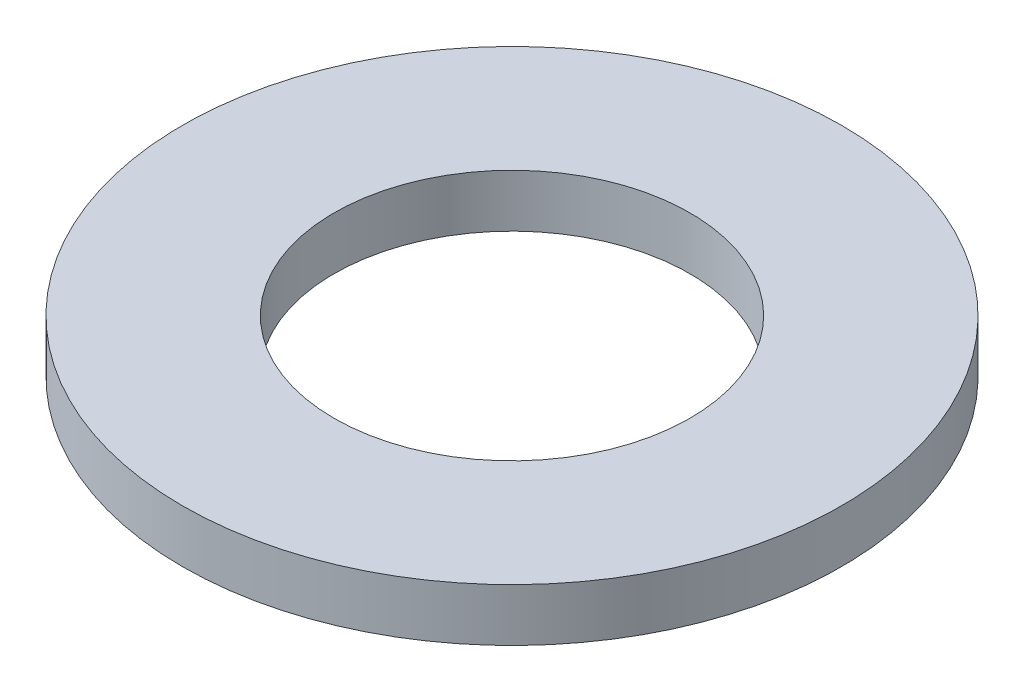
ISO-10303-21;
HEADER;
FILE_DESCRIPTION(('STEP AP214'),'2;1');
FILE_NAME('part.step','',(''),(''),'','','');
FILE_SCHEMA(('AUTOMOTIVE_DESIGN { 1 0 10303 214 1 1 1 1 }'));
ENDSEC;
DATA;
#1=APPLICATION_CONTEXT('core data for automotive mechanical design processes');
#2=APPLICATION_PROTOCOL_DEFINITION('international standard','automotive_design',2000,#1);
#3=PRODUCT_CONTEXT('',#1,'mechanical');
#4=PRODUCT('Part','Part','',(#3));
#5=PRODUCT_RELATED_PRODUCT_CATEGORY('part','',(#4));
#6=PRODUCT_DEFINITION_FORMATION('','',#4);
#7=PRODUCT_DEFINITION_CONTEXT('part definition',#1,'design');
#8=PRODUCT_DEFINITION('design','',#6,#7);
#9=PRODUCT_DEFINITION_SHAPE('','',#8);
#10=(LENGTH_UNIT() NAMED_UNIT(*) SI_UNIT(.MILLI.,.METRE.));
#11=(NAMED_UNIT(*) PLANE_ANGLE_UNIT() SI_UNIT($,.RADIAN.));
#12=(NAMED_UNIT(*) SI_UNIT($,.STERADIAN.) SOLID_ANGLE_UNIT());
#13=UNCERTAINTY_MEASURE_WITH_UNIT(LENGTH_MEASURE(1.E-05),#10,'distance_accuracy_value','');
#14=(GEOMETRIC_REPRESENTATION_CONTEXT(3) GLOBAL_UNCERTAINTY_ASSIGNED_CONTEXT((#13)) GLOBAL_UNIT_ASSIGNED_CONTEXT((#10,
#11,#12)) REPRESENTATION_CONTEXT('',''));
#15=CARTESIAN_POINT('',(0.,0.,0.));
#16=DIRECTION('',(0.,0.,1.));
#17=DIRECTION('',(1.,0.,0.));
#18=AXIS2_PLACEMENT_3D('',#15,#16,#17);
#19=CARTESIAN_POINT('',(0.,2.,0.));
#20=DIRECTION('',(0.,1.,0.));
#21=DIRECTION('',(0.,0.,1.));
#22=AXIS2_PLACEMENT_3D('',#19,#20,#21);
#23=PLANE('',#22);
#24=CARTESIAN_POINT('',(0.,2.,0.));
#25=DIRECTION('',(0.,1.,0.));
#26=DIRECTION('',(0.,0.,1.));
#27=AXIS2_PLACEMENT_3D('',#24,#25,#26);
#28=CIRCLE('',#27,12.5);
#29=CARTESIAN_POINT('',(0.,2.,12.5));
#30=VERTEX_POINT('',#29);
#31=EDGE_CURVE('E10',#30,#30,#28,.T.);
#32=ORIENTED_EDGE('',*,*,#31,.T.);
#33=EDGE_LOOP('',(#32));
#34=FACE_BOUND('',#33,.T.);
#35=CARTESIAN_POINT('',(0.,2.,0.));
#36=DIRECTION('',(0.,1.,0.));
#37=DIRECTION('',(0.,0.,1.));
#38=AXIS2_PLACEMENT_3D('',#35,#36,#37);
#39=CIRCLE('',#38,6.75);
#40=CARTESIAN_POINT('',(0.,2.,6.75));
#41=VERTEX_POINT('',#40);
#42=EDGE_CURVE('E54',#41,#41,#39,.T.);
#43=ORIENTED_EDGE('',*,*,#42,.F.);
#44=EDGE_LOOP('',(#43));
#45=FACE_BOUND('',#44,.T.);
#46=ADVANCED_FACE('F41',(#34,#45),#23,.T.);
#47=CARTESIAN_POINT('',(0.,0.,0.));
#48=DIRECTION('',(0.,1.,0.));
#49=DIRECTION('',(0.,0.,1.));
#50=AXIS2_PLACEMENT_3D('',#47,#48,#49);
#51=PLANE('',#50);
#52=CARTESIAN_POINT('',(0.,0.,0.));
#53=DIRECTION('',(0.,1.,0.));
#54=DIRECTION('',(0.,0.,1.));
#55=AXIS2_PLACEMENT_3D('',#52,#53,#54);
#56=CIRCLE('',#55,12.5);
#57=CARTESIAN_POINT('',(0.,0.,12.5));
#58=VERTEX_POINT('',#57);
#59=EDGE_CURVE('E45',#58,#58,#56,.T.);
#60=ORIENTED_EDGE('',*,*,#59,.F.);
#61=EDGE_LOOP('',(#60));
#62=FACE_BOUND('',#61,.T.);
#63=CARTESIAN_POINT('',(0.,0.,0.));
#64=DIRECTION('',(0.,1.,0.));
#65=DIRECTION('',(0.,0.,1.));
#66=AXIS2_PLACEMENT_3D('',#63,#64,#65);
#67=CIRCLE('',#66,6.75);
#68=CARTESIAN_POINT('',(0.,0.,6.75));
#69=VERTEX_POINT('',#68);
#70=EDGE_CURVE('E56',#69,#69,#67,.T.);
#71=ORIENTED_EDGE('',*,*,#70,.T.);
#72=EDGE_LOOP('',(#71));
#73=FACE_BOUND('',#72,.T.);
#74=ADVANCED_FACE('F68',(#62,#73),#51,.F.);
#75=CARTESIAN_POINT('',(0.,2.,0.));
#76=DIRECTION('',(0.,-1.,0.));
#77=DIRECTION('',(0.,0.,-1.));
#78=AXIS2_PLACEMENT_3D('',#75,#76,#77);
#79=CYLINDRICAL_SURFACE('',#78,12.5);
#80=ORIENTED_EDGE('',*,*,#31,.F.);
#81=EDGE_LOOP('',(#80));
#82=FACE_BOUND('',#81,.T.);
#83=ORIENTED_EDGE('',*,*,#59,.T.);
#84=EDGE_LOOP('',(#83));
#85=FACE_BOUND('',#84,.T.);
#86=ADVANCED_FACE('F43',(#82,#85),#79,.T.);
#87=CARTESIAN_POINT('',(0.,2.,0.));
#88=DIRECTION('',(0.,-1.,0.));
#89=DIRECTION('',(0.,0.,-1.));
#90=AXIS2_PLACEMENT_3D('',#87,#88,#89);
#91=CYLINDRICAL_SURFACE('',#90,6.75);
#92=ORIENTED_EDGE('',*,*,#42,.T.);
#93=EDGE_LOOP('',(#92));
#94=FACE_BOUND('',#93,.T.);
#95=ORIENTED_EDGE('',*,*,#70,.F.);
#96=EDGE_LOOP('',(#95));
#97=FACE_BOUND('',#96,.T.);
#98=ADVANCED_FACE('F64',(#94,#97),#91,.F.);
#99=CLOSED_SHELL('',(#46,#74,#86,#98));
#100=MANIFOLD_SOLID_BREP('B2',#99);
#101=ADVANCED_BREP_SHAPE_REPRESENTATION('',(#18,#100),#14);
#102=SHAPE_DEFINITION_REPRESENTATION(#9,#101);
ENDSEC;
END-ISO-10303-21;
